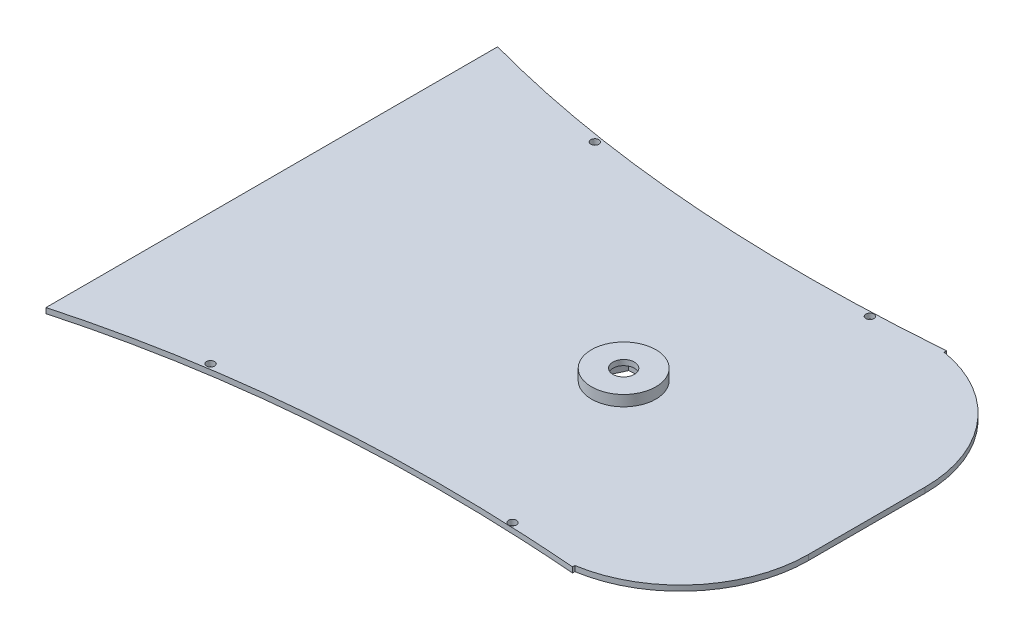
ISO-10303-21;
HEADER;
FILE_DESCRIPTION(('STEP AP214'),'2;1');
FILE_NAME('part.step','',(''),(''),'','','');
FILE_SCHEMA(('AUTOMOTIVE_DESIGN { 1 0 10303 214 1 1 1 1 }'));
ENDSEC;
DATA;
#1=APPLICATION_CONTEXT('core data for automotive mechanical design processes');
#2=APPLICATION_PROTOCOL_DEFINITION('international standard','automotive_design',2000,#1);
#3=PRODUCT_CONTEXT('',#1,'mechanical');
#4=PRODUCT('Part','Part','',(#3));
#5=PRODUCT_RELATED_PRODUCT_CATEGORY('part','',(#4));
#6=PRODUCT_DEFINITION_FORMATION('','',#4);
#7=PRODUCT_DEFINITION_CONTEXT('part definition',#1,'design');
#8=PRODUCT_DEFINITION('design','',#6,#7);
#9=PRODUCT_DEFINITION_SHAPE('','',#8);
#10=(LENGTH_UNIT() NAMED_UNIT(*) SI_UNIT(.MILLI.,.METRE.));
#11=(NAMED_UNIT(*) PLANE_ANGLE_UNIT() SI_UNIT($,.RADIAN.));
#12=(NAMED_UNIT(*) SI_UNIT($,.STERADIAN.) SOLID_ANGLE_UNIT());
#13=UNCERTAINTY_MEASURE_WITH_UNIT(LENGTH_MEASURE(1.E-05),#10,'distance_accuracy_value','');
#14=(GEOMETRIC_REPRESENTATION_CONTEXT(3) GLOBAL_UNCERTAINTY_ASSIGNED_CONTEXT((#13)) GLOBAL_UNIT_ASSIGNED_CONTEXT((#10,
#11,#12)) REPRESENTATION_CONTEXT('',''));
#15=CARTESIAN_POINT('',(0.,0.,0.));
#16=DIRECTION('',(0.,0.,1.));
#17=DIRECTION('',(1.,0.,0.));
#18=AXIS2_PLACEMENT_3D('',#15,#16,#17);
#19=CARTESIAN_POINT('',(84.8050771209825,-143.,88.0455106442292));
#20=CARTESIAN_POINT('',(88.5293106341705,-143.,87.0323355235804));
#21=CARTESIAN_POINT('',(96.0149510653416,-143.,85.0942144406827));
#22=CARTESIAN_POINT('',(110.990402818393,-143.,81.649056167692));
#23=CARTESIAN_POINT('',(129.777732341786,-143.,78.0856409426806));
#24=CARTESIAN_POINT('',(152.4093308277,-143.,74.93169338686));
#25=CARTESIAN_POINT('',(175.128665838334,-143.,72.8153522106696));
#26=CARTESIAN_POINT('',(197.928863021729,-143.,71.6657551999831));
#27=CARTESIAN_POINT('',(220.807845870508,-143.,71.4309630499266));
#28=CARTESIAN_POINT('',(243.742803934373,-143.,72.0510090482612));
#29=CARTESIAN_POINT('',(259.107355475887,-143.,73.0074184631428));
#30=CARTESIAN_POINT('',(266.767427560112,-143.,73.6027424839983));
#31=B_SPLINE_CURVE_WITH_KNOTS('',3,(#19,#20,#21,#22,#23,#24,#25,#26,#27,#28,#29,#30),
.UNSPECIFIED.,.F.,.F.,(4,1,1,1,1,1,1,1,1,4),(0.00175468654276839,0.0640540811208088,
0.126353475698849,0.25095226485493,0.375551054011011,0.500149843167092,0.624748632323173,
0.749347421479254,0.873946210635335,0.998544999791415),.UNSPECIFIED.);
#32=DIRECTION('',(0.,-1.,0.));
#33=VECTOR('',#32,1.);
#34=SURFACE_OF_LINEAR_EXTRUSION('',#31,#33);
#35=CARTESIAN_POINT('',(84.8050771209825,-145.,88.0455106442292));
#36=CARTESIAN_POINT('',(88.5293106341705,-145.,87.0323355235804));
#37=CARTESIAN_POINT('',(96.0149510653416,-145.,85.0942144406827));
#38=CARTESIAN_POINT('',(110.990402818393,-145.,81.649056167692));
#39=CARTESIAN_POINT('',(129.777732341786,-145.,78.0856409426806));
#40=CARTESIAN_POINT('',(152.4093308277,-145.,74.93169338686));
#41=CARTESIAN_POINT('',(175.128665838334,-145.,72.8153522106696));
#42=CARTESIAN_POINT('',(197.928863021729,-145.,71.6657551999831));
#43=CARTESIAN_POINT('',(220.807845870508,-145.,71.4309630499266));
#44=CARTESIAN_POINT('',(243.742803934373,-145.,72.0510090482612));
#45=CARTESIAN_POINT('',(259.107355475887,-145.,73.0074184631428));
#46=CARTESIAN_POINT('',(266.767427560112,-145.,73.6027424839983));
#47=B_SPLINE_CURVE_WITH_KNOTS('',3,(#35,#36,#37,#38,#39,#40,#41,#42,#43,#44,#45,#46),
.UNSPECIFIED.,.F.,.F.,(4,1,1,1,1,1,1,1,1,4),(0.00175468654276839,0.0640540811208088,
0.126353475698849,0.25095226485493,0.375551054011011,0.500149843167092,0.624748632323173,
0.749347421479254,0.873946210635335,0.998544999791415),.UNSPECIFIED.);
#48=CARTESIAN_POINT('',(84.8050771209825,-145.,88.0455106442292));
#49=VERTEX_POINT('',#48);
#50=CARTESIAN_POINT('',(266.767427560112,-145.,73.6027424839983));
#51=VERTEX_POINT('',#50);
#52=EDGE_CURVE('E186',#49,#51,#47,.T.);
#53=ORIENTED_EDGE('',*,*,#52,.T.);
#54=DIRECTION('',(0.,-1.,0.));
#55=VECTOR('',#54,1.);
#56=CARTESIAN_POINT('',(266.767427560112,-143.,73.6027424839983));
#57=LINE('',#56,#55);
#58=CARTESIAN_POINT('',(266.767427560112,-143.,73.6027424839983));
#59=VERTEX_POINT('',#58);
#60=EDGE_CURVE('E38',#59,#51,#57,.T.);
#61=ORIENTED_EDGE('',*,*,#60,.F.);
#62=CARTESIAN_POINT('',(84.8050771209825,-143.,88.0455106442292));
#63=VERTEX_POINT('',#62);
#64=EDGE_CURVE('E210',#63,#59,#31,.T.);
#65=ORIENTED_EDGE('',*,*,#64,.F.);
#66=DIRECTION('',(0.,-1.,0.));
#67=VECTOR('',#66,1.);
#68=CARTESIAN_POINT('',(84.8050771209825,-143.,88.0455106442292));
#69=LINE('',#68,#67);
#70=EDGE_CURVE('E141',#63,#49,#69,.T.);
#71=ORIENTED_EDGE('',*,*,#70,.T.);
#72=EDGE_LOOP('',(#53,#61,#65,#71));
#73=FACE_BOUND('',#72,.T.);
#74=ADVANCED_FACE('F34',(#73),#34,.F.);
#75=CARTESIAN_POINT('',(266.767427560112,-143.,73.6027424839983));
#76=DIRECTION('',(-1.,0.,0.));
#77=DIRECTION('',(0.,0.,1.));
#78=AXIS2_PLACEMENT_3D('',#75,#76,#77);
#79=PLANE('',#78);
#80=DIRECTION('',(0.,0.,-1.));
#81=VECTOR('',#80,1.);
#82=CARTESIAN_POINT('',(266.767427560112,-145.,73.6027424839983));
#83=LINE('',#82,#81);
#84=CARTESIAN_POINT('',(266.767427560112,-145.,72.7602764744996));
#85=VERTEX_POINT('',#84);
#86=EDGE_CURVE('E176',#51,#85,#83,.T.);
#87=ORIENTED_EDGE('',*,*,#86,.T.);
#88=DIRECTION('',(0.,-1.,0.));
#89=VECTOR('',#88,1.);
#90=CARTESIAN_POINT('',(266.767427560112,-143.,72.7602764744996));
#91=LINE('',#90,#89);
#92=CARTESIAN_POINT('',(266.767427560112,-143.,72.7602764744996));
#93=VERTEX_POINT('',#92);
#94=EDGE_CURVE('E178',#93,#85,#91,.T.);
#95=ORIENTED_EDGE('',*,*,#94,.F.);
#96=DIRECTION('',(0.,0.,-1.));
#97=VECTOR('',#96,1.);
#98=CARTESIAN_POINT('',(266.767427560112,-143.,73.6027424839983));
#99=LINE('',#98,#97);
#100=EDGE_CURVE('E101',#59,#93,#99,.T.);
#101=ORIENTED_EDGE('',*,*,#100,.F.);
#102=ORIENTED_EDGE('',*,*,#60,.T.);
#103=EDGE_LOOP('',(#87,#95,#101,#102));
#104=FACE_BOUND('',#103,.T.);
#105=ADVANCED_FACE('F169',(#104),#79,.F.);
#106=CARTESIAN_POINT('',(259.017427559958,-143.,25.6434005168099));
#107=DIRECTION('',(0.,-1.,0.));
#108=DIRECTION('',(0.,0.,-1.));
#109=AXIS2_PLACEMENT_3D('',#106,#107,#108);
#110=CYLINDRICAL_SURFACE('',#109,47.7500000001539);
#111=CARTESIAN_POINT('',(259.017427559958,-145.,25.6434005168099));
#112=DIRECTION('',(0.,1.,0.));
#113=DIRECTION('',(0.,0.,1.));
#114=AXIS2_PLACEMENT_3D('',#111,#112,#113);
#115=CIRCLE('',#114,47.7500000001539);
#116=CARTESIAN_POINT('',(306.767427560112,-145.,25.6434005167255));
#117=VERTEX_POINT('',#116);
#118=EDGE_CURVE('E185',#85,#117,#115,.T.);
#119=ORIENTED_EDGE('',*,*,#118,.T.);
#120=DIRECTION('',(0.,-1.,0.));
#121=VECTOR('',#120,1.);
#122=CARTESIAN_POINT('',(306.767427560112,-143.,25.6434005167255));
#123=LINE('',#122,#121);
#124=CARTESIAN_POINT('',(306.767427560112,-143.,25.6434005167255));
#125=VERTEX_POINT('',#124);
#126=EDGE_CURVE('E191',#125,#117,#123,.T.);
#127=ORIENTED_EDGE('',*,*,#126,.F.);
#128=CARTESIAN_POINT('',(259.017427559958,-143.,25.6434005168099));
#129=DIRECTION('',(0.,1.,0.));
#130=DIRECTION('',(0.,0.,1.));
#131=AXIS2_PLACEMENT_3D('',#128,#129,#130);
#132=CIRCLE('',#131,47.7500000001539);
#133=EDGE_CURVE('E190',#93,#125,#132,.T.);
#134=ORIENTED_EDGE('',*,*,#133,.F.);
#135=ORIENTED_EDGE('',*,*,#94,.T.);
#136=EDGE_LOOP('',(#119,#127,#134,#135));
#137=FACE_BOUND('',#136,.T.);
#138=ADVANCED_FACE('F166',(#137),#110,.T.);
#139=CARTESIAN_POINT('',(306.767427560112,-143.,25.6434005167255));
#140=DIRECTION('',(-1.,0.,0.));
#141=DIRECTION('',(0.,0.,1.));
#142=AXIS2_PLACEMENT_3D('',#139,#140,#141);
#143=PLANE('',#142);
#144=DIRECTION('',(0.,0.,-1.));
#145=VECTOR('',#144,1.);
#146=CARTESIAN_POINT('',(306.767427560112,-145.,25.6434005167255));
#147=LINE('',#146,#145);
#148=CARTESIAN_POINT('',(306.767427560112,-145.,-17.8971335947578));
#149=VERTEX_POINT('',#148);
#150=EDGE_CURVE('E195',#117,#149,#147,.T.);
#151=ORIENTED_EDGE('',*,*,#150,.T.);
#152=DIRECTION('',(0.,-1.,0.));
#153=VECTOR('',#152,1.);
#154=CARTESIAN_POINT('',(306.767427560112,-143.,-17.8971335947578));
#155=LINE('',#154,#153);
#156=CARTESIAN_POINT('',(306.767427560112,-143.,-17.8971335947578));
#157=VERTEX_POINT('',#156);
#158=EDGE_CURVE('E214',#157,#149,#155,.T.);
#159=ORIENTED_EDGE('',*,*,#158,.F.);
#160=DIRECTION('',(0.,0.,-1.));
#161=VECTOR('',#160,1.);
#162=CARTESIAN_POINT('',(306.767427560112,-143.,25.6434005167255));
#163=LINE('',#162,#161);
#164=EDGE_CURVE('E219',#125,#157,#163,.T.);
#165=ORIENTED_EDGE('',*,*,#164,.F.);
#166=ORIENTED_EDGE('',*,*,#126,.T.);
#167=EDGE_LOOP('',(#151,#159,#165,#166));
#168=FACE_BOUND('',#167,.T.);
#169=ADVANCED_FACE('F162',(#168),#143,.F.);
#170=CARTESIAN_POINT('',(259.017427560113,-143.,-17.8971335947578));
#171=DIRECTION('',(0.,-1.,0.));
#172=DIRECTION('',(0.,0.,-1.));
#173=AXIS2_PLACEMENT_3D('',#170,#171,#172);
#174=CYLINDRICAL_SURFACE('',#173,47.7499999999998);
#175=CARTESIAN_POINT('',(259.017427560113,-145.,-17.8971335947578));
#176=DIRECTION('',(0.,1.,0.));
#177=DIRECTION('',(0.,0.,1.));
#178=AXIS2_PLACEMENT_3D('',#175,#176,#177);
#179=CIRCLE('',#178,47.7499999999998);
#180=CARTESIAN_POINT('',(266.767427560112,-145.,-65.0140095523167));
#181=VERTEX_POINT('',#180);
#182=EDGE_CURVE('E197',#149,#181,#179,.T.);
#183=ORIENTED_EDGE('',*,*,#182,.T.);
#184=DIRECTION('',(0.,-1.,0.));
#185=VECTOR('',#184,1.);
#186=CARTESIAN_POINT('',(266.767427560112,-143.,-65.0140095523167));
#187=LINE('',#186,#185);
#188=CARTESIAN_POINT('',(266.767427560112,-143.,-65.0140095523167));
#189=VERTEX_POINT('',#188);
#190=EDGE_CURVE('E136',#189,#181,#187,.T.);
#191=ORIENTED_EDGE('',*,*,#190,.F.);
#192=CARTESIAN_POINT('',(259.017427560113,-143.,-17.8971335947578));
#193=DIRECTION('',(0.,1.,0.));
#194=DIRECTION('',(0.,0.,1.));
#195=AXIS2_PLACEMENT_3D('',#192,#193,#194);
#196=CIRCLE('',#195,47.7499999999998);
#197=EDGE_CURVE('E124',#157,#189,#196,.T.);
#198=ORIENTED_EDGE('',*,*,#197,.F.);
#199=ORIENTED_EDGE('',*,*,#158,.T.);
#200=EDGE_LOOP('',(#183,#191,#198,#199));
#201=FACE_BOUND('',#200,.T.);
#202=ADVANCED_FACE('F159',(#201),#174,.T.);
#203=CARTESIAN_POINT('',(266.767427560112,-143.,-65.0140095523167));
#204=DIRECTION('',(-1.,0.,0.));
#205=DIRECTION('',(0.,0.,1.));
#206=AXIS2_PLACEMENT_3D('',#203,#204,#205);
#207=PLANE('',#206);
#208=DIRECTION('',(0.,0.,-1.));
#209=VECTOR('',#208,1.);
#210=CARTESIAN_POINT('',(266.767427560112,-145.,-65.0140095523167));
#211=LINE('',#210,#209);
#212=CARTESIAN_POINT('',(266.767427560112,-145.,-65.9351608930144));
#213=VERTEX_POINT('',#212);
#214=EDGE_CURVE('E133',#181,#213,#211,.T.);
#215=ORIENTED_EDGE('',*,*,#214,.T.);
#216=DIRECTION('',(0.,-1.,0.));
#217=VECTOR('',#216,1.);
#218=CARTESIAN_POINT('',(266.767427560112,-143.,-65.9351608930144));
#219=LINE('',#218,#217);
#220=CARTESIAN_POINT('',(266.767427560112,-143.,-65.9351608930144));
#221=VERTEX_POINT('',#220);
#222=EDGE_CURVE('E130',#221,#213,#219,.T.);
#223=ORIENTED_EDGE('',*,*,#222,.F.);
#224=DIRECTION('',(0.,0.,-1.));
#225=VECTOR('',#224,1.);
#226=CARTESIAN_POINT('',(266.767427560112,-143.,-65.0140095523167));
#227=LINE('',#226,#225);
#228=EDGE_CURVE('E117',#189,#221,#227,.T.);
#229=ORIENTED_EDGE('',*,*,#228,.F.);
#230=ORIENTED_EDGE('',*,*,#190,.T.);
#231=EDGE_LOOP('',(#215,#223,#229,#230));
#232=FACE_BOUND('',#231,.T.);
#233=ADVANCED_FACE('F131',(#232),#207,.F.);
#234=CARTESIAN_POINT('',(266.767427560112,-143.,-65.9351608930144));
#235=CARTESIAN_POINT('',(259.107155635278,-143.,-65.3412770227822));
#236=CARTESIAN_POINT('',(243.742271938621,-143.,-64.3877709924516));
#237=CARTESIAN_POINT('',(220.80682334211,-143.,-63.7720731002627));
#238=CARTESIAN_POINT('',(197.927488127,-143.,-64.0112204208416));
#239=CARTESIAN_POINT('',(175.127118784748,-143.,-65.1651704693615));
#240=CARTESIAN_POINT('',(152.407872240206,-143.,-67.2858582877441));
#241=CARTESIAN_POINT('',(129.776603882585,-143.,-70.4441480288767));
#242=CARTESIAN_POINT('',(110.989691022441,-143.,-74.0111858973333));
#243=CARTESIAN_POINT('',(96.0146348997718,-143.,-77.459243676122));
#244=CARTESIAN_POINT('',(88.5291969576673,-143.,-79.3988231159493));
#245=CARTESIAN_POINT('',(84.8050771209824,-143.,-80.4127212874041));
#246=B_SPLINE_CURVE_WITH_KNOTS('',3,(#234,#235,#236,#237,#238,#239,#240,#241,#242,#243,#244,
#245),.UNSPECIFIED.,.F.,.F.,(4,1,1,1,1,1,1,1,1,4),(0.00145531518511966,0.126054107355505,
0.250652899525891,0.375251691696276,0.499850483866662,0.624449276037048,0.749048068207433,
0.873646860377819,0.935946256463011,0.998245652548204),.UNSPECIFIED.);
#247=DIRECTION('',(0.,-1.,0.));
#248=VECTOR('',#247,1.);
#249=SURFACE_OF_LINEAR_EXTRUSION('',#246,#248);
#250=CARTESIAN_POINT('',(266.767427560112,-145.,-65.9351608930144));
#251=CARTESIAN_POINT('',(259.107155635278,-145.,-65.3412770227822));
#252=CARTESIAN_POINT('',(243.742271938621,-145.,-64.3877709924516));
#253=CARTESIAN_POINT('',(220.80682334211,-145.,-63.7720731002627));
#254=CARTESIAN_POINT('',(197.927488127,-145.,-64.0112204208416));
#255=CARTESIAN_POINT('',(175.127118784748,-145.,-65.1651704693615));
#256=CARTESIAN_POINT('',(152.407872240206,-145.,-67.2858582877441));
#257=CARTESIAN_POINT('',(129.776603882585,-145.,-70.4441480288767));
#258=CARTESIAN_POINT('',(110.989691022441,-145.,-74.0111858973333));
#259=CARTESIAN_POINT('',(96.0146348997718,-145.,-77.459243676122));
#260=CARTESIAN_POINT('',(88.5291969576673,-145.,-79.3988231159493));
#261=CARTESIAN_POINT('',(84.8050771209824,-145.,-80.4127212874041));
#262=B_SPLINE_CURVE_WITH_KNOTS('',3,(#250,#251,#252,#253,#254,#255,#256,#257,#258,#259,#260,
#261),.UNSPECIFIED.,.F.,.F.,(4,1,1,1,1,1,1,1,1,4),(0.00145531518511966,0.126054107355505,
0.250652899525891,0.375251691696276,0.499850483866662,0.624449276037048,0.749048068207433,
0.873646860377819,0.935946256463011,0.998245652548204),.UNSPECIFIED.);
#263=CARTESIAN_POINT('',(84.8050771209824,-145.,-80.4127212874041));
#264=VERTEX_POINT('',#263);
#265=EDGE_CURVE('E202',#213,#264,#262,.T.);
#266=ORIENTED_EDGE('',*,*,#265,.T.);
#267=DIRECTION('',(0.,-1.,0.));
#268=VECTOR('',#267,1.);
#269=CARTESIAN_POINT('',(84.8050771209824,-143.,-80.4127212874041));
#270=LINE('',#269,#268);
#271=CARTESIAN_POINT('',(84.8050771209824,-143.,-80.4127212874041));
#272=VERTEX_POINT('',#271);
#273=EDGE_CURVE('E137',#272,#264,#270,.T.);
#274=ORIENTED_EDGE('',*,*,#273,.F.);
#275=EDGE_CURVE('E121',#221,#272,#246,.T.);
#276=ORIENTED_EDGE('',*,*,#275,.F.);
#277=ORIENTED_EDGE('',*,*,#222,.T.);
#278=EDGE_LOOP('',(#266,#274,#276,#277));
#279=FACE_BOUND('',#278,.T.);
#280=ADVANCED_FACE('F139',(#279),#249,.F.);
#281=CARTESIAN_POINT('',(84.8050771209824,-143.,-80.4127212874041));
#282=DIRECTION('',(1.,0.,0.));
#283=DIRECTION('',(0.,0.,-1.));
#284=AXIS2_PLACEMENT_3D('',#281,#282,#283);
#285=PLANE('',#284);
#286=DIRECTION('',(0.,0.,1.));
#287=VECTOR('',#286,1.);
#288=CARTESIAN_POINT('',(84.8050771209824,-145.,-80.4127212874041));
#289=LINE('',#288,#287);
#290=EDGE_CURVE('E92',#264,#49,#289,.T.);
#291=ORIENTED_EDGE('',*,*,#290,.T.);
#292=ORIENTED_EDGE('',*,*,#70,.F.);
#293=DIRECTION('',(0.,0.,1.));
#294=VECTOR('',#293,1.);
#295=CARTESIAN_POINT('',(84.8050771209824,-143.,-80.4127212874041));
#296=LINE('',#295,#294);
#297=EDGE_CURVE('E59',#272,#63,#296,.T.);
#298=ORIENTED_EDGE('',*,*,#297,.F.);
#299=ORIENTED_EDGE('',*,*,#273,.T.);
#300=EDGE_LOOP('',(#291,#292,#298,#299));
#301=FACE_BOUND('',#300,.T.);
#302=ADVANCED_FACE('F155',(#301),#285,.F.);
#303=CARTESIAN_POINT('',(175.142142867127,-143.,72.9764762382536));
#304=DIRECTION('',(0.,1.,0.));
#305=DIRECTION('',(0.,0.,1.));
#306=AXIS2_PLACEMENT_3D('',#303,#304,#305);
#307=PLANE('',#306);
#308=CARTESIAN_POINT('',(216.151763309972,-143.,3.91803256513333));
#309=DIRECTION('',(0.,1.,0.));
#310=DIRECTION('',(0.,0.,1.));
#311=AXIS2_PLACEMENT_3D('',#308,#309,#310);
#312=CIRCLE('',#311,12.);
#313=CARTESIAN_POINT('',(216.151763309972,-143.,15.9180325651333));
#314=VERTEX_POINT('',#313);
#315=EDGE_CURVE('E11',#314,#314,#312,.T.);
#316=ORIENTED_EDGE('',*,*,#315,.F.);
#317=EDGE_LOOP('',(#316));
#318=FACE_BOUND('',#317,.T.);
#319=CARTESIAN_POINT('',(241.293747278359,-143.,-62.7723674550962));
#320=DIRECTION('',(0.,-1.,0.));
#321=DIRECTION('',(0.,0.,-1.));
#322=AXIS2_PLACEMENT_3D('',#319,#320,#321);
#323=CIRCLE('',#322,1.5);
#324=CARTESIAN_POINT('',(241.293747278359,-143.,-64.2723674550962));
#325=VERTEX_POINT('',#324);
#326=EDGE_CURVE('E240',#325,#325,#323,.T.);
#327=ORIENTED_EDGE('',*,*,#326,.T.);
#328=EDGE_LOOP('',(#327));
#329=FACE_BOUND('',#328,.T.);
#330=CARTESIAN_POINT('',(133.692207926038,-143.,-67.792864213221));
#331=DIRECTION('',(0.,-1.,0.));
#332=DIRECTION('',(0.,0.,-1.));
#333=AXIS2_PLACEMENT_3D('',#330,#331,#332);
#334=CIRCLE('',#333,1.5);
#335=CARTESIAN_POINT('',(133.692207926038,-143.,-69.292864213221));
#336=VERTEX_POINT('',#335);
#337=EDGE_CURVE('E247',#336,#336,#334,.T.);
#338=ORIENTED_EDGE('',*,*,#337,.T.);
#339=EDGE_LOOP('',(#338));
#340=FACE_BOUND('',#339,.T.);
#341=CARTESIAN_POINT('',(133.692207926038,-143.,75.5391224986828));
#342=DIRECTION('',(0.,-1.,0.));
#343=DIRECTION('',(0.,0.,-1.));
#344=AXIS2_PLACEMENT_3D('',#341,#342,#343);
#345=CIRCLE('',#344,1.50000000002185);
#346=CARTESIAN_POINT('',(133.692207926038,-143.,74.0391224986609));
#347=VERTEX_POINT('',#346);
#348=EDGE_CURVE('E234',#347,#347,#345,.T.);
#349=ORIENTED_EDGE('',*,*,#348,.T.);
#350=EDGE_LOOP('',(#349));
#351=FACE_BOUND('',#350,.T.);
#352=CARTESIAN_POINT('',(241.293747278359,-143.,70.518625740558));
#353=DIRECTION('',(0.,-1.,0.));
#354=DIRECTION('',(0.,0.,-1.));
#355=AXIS2_PLACEMENT_3D('',#352,#353,#354);
#356=CIRCLE('',#355,1.50000000002188);
#357=CARTESIAN_POINT('',(241.293747278359,-143.,69.0186257405361));
#358=VERTEX_POINT('',#357);
#359=EDGE_CURVE('E233',#358,#358,#356,.T.);
#360=ORIENTED_EDGE('',*,*,#359,.T.);
#361=EDGE_LOOP('',(#360));
#362=FACE_BOUND('',#361,.T.);
#363=ORIENTED_EDGE('',*,*,#64,.T.);
#364=ORIENTED_EDGE('',*,*,#100,.T.);
#365=ORIENTED_EDGE('',*,*,#133,.T.);
#366=ORIENTED_EDGE('',*,*,#164,.T.);
#367=ORIENTED_EDGE('',*,*,#197,.T.);
#368=ORIENTED_EDGE('',*,*,#228,.T.);
#369=ORIENTED_EDGE('',*,*,#275,.T.);
#370=ORIENTED_EDGE('',*,*,#297,.T.);
#371=EDGE_LOOP('',(#363,#364,#365,#366,#367,#368,#369,#370));
#372=FACE_BOUND('',#371,.T.);
#373=ADVANCED_FACE('F119',(#318,#329,#340,#351,#362,#372),#307,.T.);
#374=CARTESIAN_POINT('',(175.142142867127,-145.,72.9764762382536));
#375=DIRECTION('',(0.,1.,0.));
#376=DIRECTION('',(0.,0.,1.));
#377=AXIS2_PLACEMENT_3D('',#374,#375,#376);
#378=PLANE('',#377);
#379=DIRECTION('',(0.571909400847656,0.,0.820316790771757));
#380=VECTOR('',#379,1.);
#381=CARTESIAN_POINT('',(219.337574147534,-145.,-2.87784432019993));
#382=LINE('',#381,#380);
#383=CARTESIAN_POINT('',(219.337574147534,-145.,-2.87784432019992));
#384=VERTEX_POINT('',#383);
#385=CARTESIAN_POINT('',(223.630070752443,-145.,3.27908723944708));
#386=VERTEX_POINT('',#385);
#387=EDGE_CURVE('E287',#384,#386,#382,.T.);
#388=ORIENTED_EDGE('',*,*,#387,.F.);
#389=DIRECTION('',(0.996369880383094,0.,-0.0851296744113312));
#390=VECTOR('',#389,1.);
#391=CARTESIAN_POINT('',(211.859266705063,-145.,-2.23889899451363));
#392=LINE('',#391,#390);
#393=CARTESIAN_POINT('',(211.859266705063,-145.,-2.23889899451363));
#394=VERTEX_POINT('',#393);
#395=EDGE_CURVE('E50',#394,#384,#392,.T.);
#396=ORIENTED_EDGE('',*,*,#395,.F.);
#397=DIRECTION('',(0.424460479535437,0.,-0.905446465183087));
#398=VECTOR('',#397,1.);
#399=CARTESIAN_POINT('',(208.673455867501,-145.,4.55697789081965));
#400=LINE('',#399,#398);
#401=CARTESIAN_POINT('',(208.673455867501,-145.,4.55697789081965));
#402=VERTEX_POINT('',#401);
#403=EDGE_CURVE('E274',#402,#394,#400,.T.);
#404=ORIENTED_EDGE('',*,*,#403,.F.);
#405=DIRECTION('',(-0.571909400847658,0.,-0.820316790771756));
#406=VECTOR('',#405,1.);
#407=CARTESIAN_POINT('',(212.96595247241,-145.,10.7139094504666));
#408=LINE('',#407,#406);
#409=CARTESIAN_POINT('',(212.96595247241,-145.,10.7139094504666));
#410=VERTEX_POINT('',#409);
#411=EDGE_CURVE('E278',#410,#402,#408,.T.);
#412=ORIENTED_EDGE('',*,*,#411,.F.);
#413=DIRECTION('',(-0.996369880383094,0.,0.085129674411331));
#414=VECTOR('',#413,1.);
#415=CARTESIAN_POINT('',(220.444259914882,-145.,10.0749641247802));
#416=LINE('',#415,#414);
#417=CARTESIAN_POINT('',(220.444259914882,-145.,10.0749641247802));
#418=VERTEX_POINT('',#417);
#419=EDGE_CURVE('E281',#418,#410,#416,.T.);
#420=ORIENTED_EDGE('',*,*,#419,.F.);
#421=DIRECTION('',(-0.424460479535434,0.,0.905446465183088));
#422=VECTOR('',#421,1.);
#423=CARTESIAN_POINT('',(223.630070752443,-145.,3.27908723944708));
#424=LINE('',#423,#422);
#425=EDGE_CURVE('E284',#386,#418,#424,.T.);
#426=ORIENTED_EDGE('',*,*,#425,.F.);
#427=EDGE_LOOP('',(#388,#396,#404,#412,#420,#426));
#428=FACE_BOUND('',#427,.T.);
#429=CARTESIAN_POINT('',(241.293747278359,-145.,-62.7723674550962));
#430=DIRECTION('',(0.,-1.,0.));
#431=DIRECTION('',(0.,0.,-1.));
#432=AXIS2_PLACEMENT_3D('',#429,#430,#431);
#433=CIRCLE('',#432,1.5);
#434=CARTESIAN_POINT('',(241.293747278359,-145.,-64.2723674550962));
#435=VERTEX_POINT('',#434);
#436=EDGE_CURVE('E237',#435,#435,#433,.T.);
#437=ORIENTED_EDGE('',*,*,#436,.F.);
#438=EDGE_LOOP('',(#437));
#439=FACE_BOUND('',#438,.T.);
#440=CARTESIAN_POINT('',(133.692207926038,-145.,-67.792864213221));
#441=DIRECTION('',(0.,-1.,0.));
#442=DIRECTION('',(0.,0.,-1.));
#443=AXIS2_PLACEMENT_3D('',#440,#441,#442);
#444=CIRCLE('',#443,1.5);
#445=CARTESIAN_POINT('',(133.692207926038,-145.,-69.292864213221));
#446=VERTEX_POINT('',#445);
#447=EDGE_CURVE('E244',#446,#446,#444,.T.);
#448=ORIENTED_EDGE('',*,*,#447,.F.);
#449=EDGE_LOOP('',(#448));
#450=FACE_BOUND('',#449,.T.);
#451=CARTESIAN_POINT('',(133.692207926038,-145.,75.5391224986828));
#452=DIRECTION('',(0.,-1.,0.));
#453=DIRECTION('',(0.,0.,-1.));
#454=AXIS2_PLACEMENT_3D('',#451,#452,#453);
#455=CIRCLE('',#454,1.50000000002185);
#456=CARTESIAN_POINT('',(133.692207926038,-145.,74.0391224986609));
#457=VERTEX_POINT('',#456);
#458=EDGE_CURVE('E250',#457,#457,#455,.T.);
#459=ORIENTED_EDGE('',*,*,#458,.F.);
#460=EDGE_LOOP('',(#459));
#461=FACE_BOUND('',#460,.T.);
#462=CARTESIAN_POINT('',(241.293747278359,-145.,70.518625740558));
#463=DIRECTION('',(0.,-1.,0.));
#464=DIRECTION('',(0.,0.,-1.));
#465=AXIS2_PLACEMENT_3D('',#462,#463,#464);
#466=CIRCLE('',#465,1.50000000002188);
#467=CARTESIAN_POINT('',(241.293747278359,-145.,69.0186257405361));
#468=VERTEX_POINT('',#467);
#469=EDGE_CURVE('E227',#468,#468,#466,.T.);
#470=ORIENTED_EDGE('',*,*,#469,.F.);
#471=EDGE_LOOP('',(#470));
#472=FACE_BOUND('',#471,.T.);
#473=ORIENTED_EDGE('',*,*,#52,.F.);
#474=ORIENTED_EDGE('',*,*,#290,.F.);
#475=ORIENTED_EDGE('',*,*,#265,.F.);
#476=ORIENTED_EDGE('',*,*,#214,.F.);
#477=ORIENTED_EDGE('',*,*,#182,.F.);
#478=ORIENTED_EDGE('',*,*,#150,.F.);
#479=ORIENTED_EDGE('',*,*,#118,.F.);
#480=ORIENTED_EDGE('',*,*,#86,.F.);
#481=EDGE_LOOP('',(#473,#474,#475,#476,#477,#478,#479,#480));
#482=FACE_BOUND('',#481,.T.);
#483=ADVANCED_FACE('F193',(#428,#439,#450,#461,#472,#482),#378,.F.);
#484=CARTESIAN_POINT('',(241.293747278359,-143.,70.518625740558));
#485=DIRECTION('',(0.,-1.,0.));
#486=DIRECTION('',(0.,0.,-1.));
#487=AXIS2_PLACEMENT_3D('',#484,#485,#486);
#488=CYLINDRICAL_SURFACE('',#487,1.50000000002188);
#489=ORIENTED_EDGE('',*,*,#359,.F.);
#490=EDGE_LOOP('',(#489));
#491=FACE_BOUND('',#490,.T.);
#492=ORIENTED_EDGE('',*,*,#469,.T.);
#493=EDGE_LOOP('',(#492));
#494=FACE_BOUND('',#493,.T.);
#495=ADVANCED_FACE('F395',(#491,#494),#488,.F.);
#496=CARTESIAN_POINT('',(133.692207926038,-143.,75.5391224986828));
#497=DIRECTION('',(0.,-1.,0.));
#498=DIRECTION('',(0.,0.,-1.));
#499=AXIS2_PLACEMENT_3D('',#496,#497,#498);
#500=CYLINDRICAL_SURFACE('',#499,1.50000000002185);
#501=ORIENTED_EDGE('',*,*,#348,.F.);
#502=EDGE_LOOP('',(#501));
#503=FACE_BOUND('',#502,.T.);
#504=ORIENTED_EDGE('',*,*,#458,.T.);
#505=EDGE_LOOP('',(#504));
#506=FACE_BOUND('',#505,.T.);
#507=ADVANCED_FACE('F391',(#503,#506),#500,.F.);
#508=CARTESIAN_POINT('',(133.692207926038,-143.,-67.792864213221));
#509=DIRECTION('',(0.,-1.,0.));
#510=DIRECTION('',(0.,0.,-1.));
#511=AXIS2_PLACEMENT_3D('',#508,#509,#510);
#512=CYLINDRICAL_SURFACE('',#511,1.5);
#513=ORIENTED_EDGE('',*,*,#337,.F.);
#514=EDGE_LOOP('',(#513));
#515=FACE_BOUND('',#514,.T.);
#516=ORIENTED_EDGE('',*,*,#447,.T.);
#517=EDGE_LOOP('',(#516));
#518=FACE_BOUND('',#517,.T.);
#519=ADVANCED_FACE('F394',(#515,#518),#512,.F.);
#520=CARTESIAN_POINT('',(241.293747278359,-143.,-62.7723674550962));
#521=DIRECTION('',(0.,-1.,0.));
#522=DIRECTION('',(0.,0.,-1.));
#523=AXIS2_PLACEMENT_3D('',#520,#521,#522);
#524=CYLINDRICAL_SURFACE('',#523,1.5);
#525=ORIENTED_EDGE('',*,*,#326,.F.);
#526=EDGE_LOOP('',(#525));
#527=FACE_BOUND('',#526,.T.);
#528=ORIENTED_EDGE('',*,*,#436,.T.);
#529=EDGE_LOOP('',(#528));
#530=FACE_BOUND('',#529,.T.);
#531=ADVANCED_FACE('F389',(#527,#530),#524,.F.);
#532=CARTESIAN_POINT('',(216.151763309972,-139.,3.91803256513333));
#533=DIRECTION('',(0.,-1.,0.));
#534=DIRECTION('',(0.,0.,-1.));
#535=AXIS2_PLACEMENT_3D('',#532,#533,#534);
#536=CYLINDRICAL_SURFACE('',#535,12.);
#537=ORIENTED_EDGE('',*,*,#315,.T.);
#538=EDGE_LOOP('',(#537));
#539=FACE_BOUND('',#538,.T.);
#540=CARTESIAN_POINT('',(216.151763309972,-139.,3.91803256513333));
#541=DIRECTION('',(0.,-1.,0.));
#542=DIRECTION('',(0.,0.,-1.));
#543=AXIS2_PLACEMENT_3D('',#540,#541,#542);
#544=CIRCLE('',#543,12.);
#545=CARTESIAN_POINT('',(216.151763309972,-139.,-8.08196743486667));
#546=VERTEX_POINT('',#545);
#547=EDGE_CURVE('E241',#546,#546,#544,.T.);
#548=ORIENTED_EDGE('',*,*,#547,.T.);
#549=EDGE_LOOP('',(#548));
#550=FACE_BOUND('',#549,.T.);
#551=ADVANCED_FACE('F385',(#539,#550),#536,.T.);
#552=CARTESIAN_POINT('',(216.151763309972,-139.,3.91803256513333));
#553=DIRECTION('',(0.,-1.,0.));
#554=DIRECTION('',(0.,0.,-1.));
#555=AXIS2_PLACEMENT_3D('',#552,#553,#554);
#556=PLANE('',#555);
#557=CARTESIAN_POINT('',(216.151763309972,-139.,3.91803256513333));
#558=DIRECTION('',(0.,-1.,0.));
#559=DIRECTION('',(0.,0.,-1.));
#560=AXIS2_PLACEMENT_3D('',#557,#558,#559);
#561=CIRCLE('',#560,3.99999999999999);
#562=CARTESIAN_POINT('',(216.151763309972,-139.,-0.0819674348666614));
#563=VERTEX_POINT('',#562);
#564=EDGE_CURVE('E291',#563,#563,#561,.F.);
#565=ORIENTED_EDGE('',*,*,#564,.F.);
#566=EDGE_LOOP('',(#565));
#567=FACE_BOUND('',#566,.T.);
#568=ORIENTED_EDGE('',*,*,#547,.F.);
#569=EDGE_LOOP('',(#568));
#570=FACE_BOUND('',#569,.T.);
#571=ADVANCED_FACE('F382',(#567,#570),#556,.F.);
#572=CARTESIAN_POINT('',(211.859266705063,-141.,-2.23889899451363));
#573=DIRECTION('',(-0.0851296744113312,0.,-0.996369880383094));
#574=DIRECTION('',(-0.996369880383094,0.,0.0851296744113312));
#575=AXIS2_PLACEMENT_3D('',#572,#573,#574);
#576=PLANE('',#575);
#577=ORIENTED_EDGE('',*,*,#395,.T.);
#578=DIRECTION('',(0.,-1.,0.));
#579=VECTOR('',#578,1.);
#580=CARTESIAN_POINT('',(219.337574147534,-141.,-2.87784432019993));
#581=LINE('',#580,#579);
#582=CARTESIAN_POINT('',(219.337574147534,-141.,-2.87784432019993));
#583=VERTEX_POINT('',#582);
#584=EDGE_CURVE('E258',#583,#384,#581,.T.);
#585=ORIENTED_EDGE('',*,*,#584,.F.);
#586=DIRECTION('',(0.996369880383094,0.,-0.0851296744113312));
#587=VECTOR('',#586,1.);
#588=CARTESIAN_POINT('',(211.859266705063,-141.,-2.23889899451363));
#589=LINE('',#588,#587);
#590=CARTESIAN_POINT('',(211.859266705063,-141.,-2.23889899451363));
#591=VERTEX_POINT('',#590);
#592=EDGE_CURVE('E277',#591,#583,#589,.T.);
#593=ORIENTED_EDGE('',*,*,#592,.F.);
#594=DIRECTION('',(0.,-1.,0.));
#595=VECTOR('',#594,1.);
#596=CARTESIAN_POINT('',(211.859266705063,-141.,-2.23889899451363));
#597=LINE('',#596,#595);
#598=EDGE_CURVE('E257',#591,#394,#597,.T.);
#599=ORIENTED_EDGE('',*,*,#598,.T.);
#600=EDGE_LOOP('',(#577,#585,#593,#599));
#601=FACE_BOUND('',#600,.T.);
#602=ADVANCED_FACE('F328',(#601),#576,.F.);
#603=CARTESIAN_POINT('',(208.673455867501,-141.,4.55697789081965));
#604=DIRECTION('',(-0.905446465183087,0.,-0.424460479535437));
#605=DIRECTION('',(-0.424460479535437,0.,0.905446465183087));
#606=AXIS2_PLACEMENT_3D('',#603,#604,#605);
#607=PLANE('',#606);
#608=ORIENTED_EDGE('',*,*,#403,.T.);
#609=ORIENTED_EDGE('',*,*,#598,.F.);
#610=DIRECTION('',(0.424460479535437,0.,-0.905446465183087));
#611=VECTOR('',#610,1.);
#612=CARTESIAN_POINT('',(208.673455867501,-141.,4.55697789081965));
#613=LINE('',#612,#611);
#614=CARTESIAN_POINT('',(208.673455867501,-141.,4.55697789081965));
#615=VERTEX_POINT('',#614);
#616=EDGE_CURVE('E261',#615,#591,#613,.T.);
#617=ORIENTED_EDGE('',*,*,#616,.F.);
#618=DIRECTION('',(0.,-1.,0.));
#619=VECTOR('',#618,1.);
#620=CARTESIAN_POINT('',(208.673455867501,-141.,4.55697789081965));
#621=LINE('',#620,#619);
#622=EDGE_CURVE('E270',#615,#402,#621,.T.);
#623=ORIENTED_EDGE('',*,*,#622,.T.);
#624=EDGE_LOOP('',(#608,#609,#617,#623));
#625=FACE_BOUND('',#624,.T.);
#626=ADVANCED_FACE('F344',(#625),#607,.F.);
#627=CARTESIAN_POINT('',(212.96595247241,-141.,10.7139094504666));
#628=DIRECTION('',(-0.820316790771756,0.,0.571909400847658));
#629=DIRECTION('',(0.571909400847658,0.,0.820316790771756));
#630=AXIS2_PLACEMENT_3D('',#627,#628,#629);
#631=PLANE('',#630);
#632=ORIENTED_EDGE('',*,*,#411,.T.);
#633=ORIENTED_EDGE('',*,*,#622,.F.);
#634=DIRECTION('',(-0.571909400847658,0.,-0.820316790771756));
#635=VECTOR('',#634,1.);
#636=CARTESIAN_POINT('',(212.96595247241,-141.,10.7139094504666));
#637=LINE('',#636,#635);
#638=CARTESIAN_POINT('',(212.96595247241,-141.,10.7139094504666));
#639=VERTEX_POINT('',#638);
#640=EDGE_CURVE('E294',#639,#615,#637,.T.);
#641=ORIENTED_EDGE('',*,*,#640,.F.);
#642=DIRECTION('',(0.,-1.,0.));
#643=VECTOR('',#642,1.);
#644=CARTESIAN_POINT('',(212.96595247241,-141.,10.7139094504666));
#645=LINE('',#644,#643);
#646=EDGE_CURVE('E267',#639,#410,#645,.T.);
#647=ORIENTED_EDGE('',*,*,#646,.T.);
#648=EDGE_LOOP('',(#632,#633,#641,#647));
#649=FACE_BOUND('',#648,.T.);
#650=ADVANCED_FACE('F349',(#649),#631,.F.);
#651=CARTESIAN_POINT('',(220.444259914882,-141.,10.0749641247802));
#652=DIRECTION('',(0.085129674411331,0.,0.996369880383094));
#653=DIRECTION('',(0.996369880383094,0.,-0.085129674411331));
#654=AXIS2_PLACEMENT_3D('',#651,#652,#653);
#655=PLANE('',#654);
#656=ORIENTED_EDGE('',*,*,#419,.T.);
#657=ORIENTED_EDGE('',*,*,#646,.F.);
#658=DIRECTION('',(-0.996369880383094,0.,0.085129674411331));
#659=VECTOR('',#658,1.);
#660=CARTESIAN_POINT('',(220.444259914882,-141.,10.0749641247802));
#661=LINE('',#660,#659);
#662=CARTESIAN_POINT('',(220.444259914882,-141.,10.0749641247802));
#663=VERTEX_POINT('',#662);
#664=EDGE_CURVE('E297',#663,#639,#661,.T.);
#665=ORIENTED_EDGE('',*,*,#664,.F.);
#666=DIRECTION('',(0.,-1.,0.));
#667=VECTOR('',#666,1.);
#668=CARTESIAN_POINT('',(220.444259914882,-141.,10.0749641247802));
#669=LINE('',#668,#667);
#670=EDGE_CURVE('E264',#663,#418,#669,.T.);
#671=ORIENTED_EDGE('',*,*,#670,.T.);
#672=EDGE_LOOP('',(#656,#657,#665,#671));
#673=FACE_BOUND('',#672,.T.);
#674=ADVANCED_FACE('F367',(#673),#655,.F.);
#675=CARTESIAN_POINT('',(223.630070752443,-141.,3.27908723944708));
#676=DIRECTION('',(0.905446465183088,0.,0.424460479535434));
#677=DIRECTION('',(0.424460479535434,0.,-0.905446465183088));
#678=AXIS2_PLACEMENT_3D('',#675,#676,#677);
#679=PLANE('',#678);
#680=ORIENTED_EDGE('',*,*,#425,.T.);
#681=ORIENTED_EDGE('',*,*,#670,.F.);
#682=DIRECTION('',(-0.424460479535434,0.,0.905446465183088));
#683=VECTOR('',#682,1.);
#684=CARTESIAN_POINT('',(223.630070752443,-141.,3.27908723944708));
#685=LINE('',#684,#683);
#686=CARTESIAN_POINT('',(223.630070752443,-141.,3.27908723944708));
#687=VERTEX_POINT('',#686);
#688=EDGE_CURVE('E300',#687,#663,#685,.T.);
#689=ORIENTED_EDGE('',*,*,#688,.F.);
#690=DIRECTION('',(0.,-1.,0.));
#691=VECTOR('',#690,1.);
#692=CARTESIAN_POINT('',(223.630070752443,-141.,3.27908723944708));
#693=LINE('',#692,#691);
#694=EDGE_CURVE('E260',#687,#386,#693,.T.);
#695=ORIENTED_EDGE('',*,*,#694,.T.);
#696=EDGE_LOOP('',(#680,#681,#689,#695));
#697=FACE_BOUND('',#696,.T.);
#698=ADVANCED_FACE('F363',(#697),#679,.F.);
#699=CARTESIAN_POINT('',(219.337574147534,-141.,-2.87784432019993));
#700=DIRECTION('',(0.820316790771757,0.,-0.571909400847656));
#701=DIRECTION('',(-0.571909400847656,0.,-0.820316790771757));
#702=AXIS2_PLACEMENT_3D('',#699,#700,#701);
#703=PLANE('',#702);
#704=ORIENTED_EDGE('',*,*,#387,.T.);
#705=ORIENTED_EDGE('',*,*,#694,.F.);
#706=DIRECTION('',(0.571909400847656,0.,0.820316790771757));
#707=VECTOR('',#706,1.);
#708=CARTESIAN_POINT('',(219.337574147534,-141.,-2.87784432019993));
#709=LINE('',#708,#707);
#710=EDGE_CURVE('E303',#583,#687,#709,.T.);
#711=ORIENTED_EDGE('',*,*,#710,.F.);
#712=ORIENTED_EDGE('',*,*,#584,.T.);
#713=EDGE_LOOP('',(#704,#705,#711,#712));
#714=FACE_BOUND('',#713,.T.);
#715=ADVANCED_FACE('F320',(#714),#703,.F.);
#716=CARTESIAN_POINT('',(0.,-141.,0.));
#717=DIRECTION('',(0.,-1.,0.));
#718=DIRECTION('',(0.,0.,-1.));
#719=AXIS2_PLACEMENT_3D('',#716,#717,#718);
#720=PLANE('',#719);
#721=CARTESIAN_POINT('',(216.151763309972,-141.,3.91803256513333));
#722=DIRECTION('',(0.,-1.,0.));
#723=DIRECTION('',(0.,0.,-1.));
#724=AXIS2_PLACEMENT_3D('',#721,#722,#723);
#725=CIRCLE('',#724,3.99999999999999);
#726=CARTESIAN_POINT('',(216.151763309972,-141.,-0.0819674348666614));
#727=VERTEX_POINT('',#726);
#728=EDGE_CURVE('E310',#727,#727,#725,.T.);
#729=ORIENTED_EDGE('',*,*,#728,.F.);
#730=EDGE_LOOP('',(#729));
#731=FACE_BOUND('',#730,.T.);
#732=ORIENTED_EDGE('',*,*,#592,.T.);
#733=ORIENTED_EDGE('',*,*,#710,.T.);
#734=ORIENTED_EDGE('',*,*,#688,.T.);
#735=ORIENTED_EDGE('',*,*,#664,.T.);
#736=ORIENTED_EDGE('',*,*,#640,.T.);
#737=ORIENTED_EDGE('',*,*,#616,.T.);
#738=EDGE_LOOP('',(#732,#733,#734,#735,#736,#737));
#739=FACE_BOUND('',#738,.T.);
#740=ADVANCED_FACE('F317',(#731,#739),#720,.T.);
#741=CARTESIAN_POINT('',(216.151763309972,-138.999,3.91803256513333));
#742=DIRECTION('',(0.,-1.,0.));
#743=DIRECTION('',(0.,0.,-1.));
#744=AXIS2_PLACEMENT_3D('',#741,#742,#743);
#745=CYLINDRICAL_SURFACE('',#744,3.99999999999999);
#746=ORIENTED_EDGE('',*,*,#728,.T.);
#747=EDGE_LOOP('',(#746));
#748=FACE_BOUND('',#747,.T.);
#749=ORIENTED_EDGE('',*,*,#564,.T.);
#750=EDGE_LOOP('',(#749));
#751=FACE_BOUND('',#750,.T.);
#752=ADVANCED_FACE('F314',(#748,#751),#745,.F.);
#753=CLOSED_SHELL('',(#74,#105,#138,#169,#202,#233,#280,#302,#373,#483,#495,#507,#519,#531,#551,
#571,#602,#626,#650,#674,#698,#715,#740,#752));
#754=MANIFOLD_SOLID_BREP('B2',#753);
#755=ADVANCED_BREP_SHAPE_REPRESENTATION('',(#18,#754),#14);
#756=SHAPE_DEFINITION_REPRESENTATION(#9,#755);
ENDSEC;
END-ISO-10303-21;
